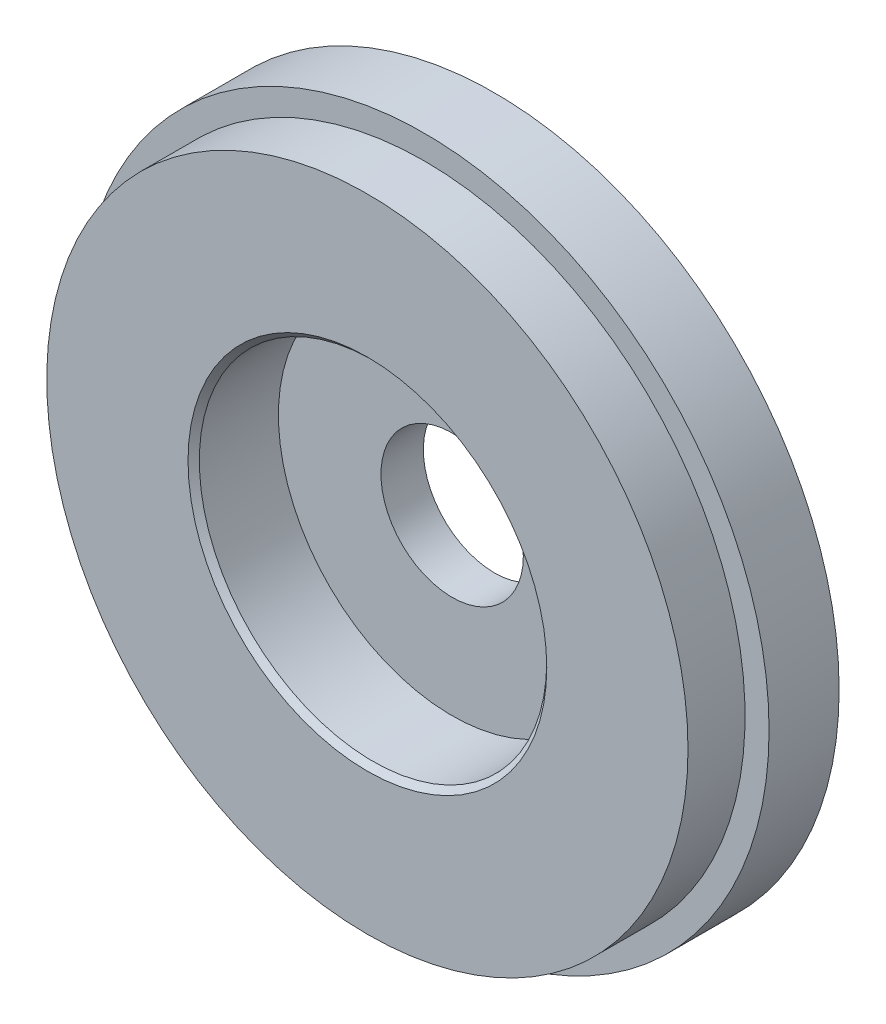
ISO-10303-21;
HEADER;
FILE_DESCRIPTION(('STEP AP214'),'2;1');
FILE_NAME('part.step','',(''),(''),'','','');
FILE_SCHEMA(('AUTOMOTIVE_DESIGN { 1 0 10303 214 1 1 1 1 }'));
ENDSEC;
DATA;
#1=APPLICATION_CONTEXT('core data for automotive mechanical design processes');
#2=APPLICATION_PROTOCOL_DEFINITION('international standard','automotive_design',2000,#1);
#3=PRODUCT_CONTEXT('',#1,'mechanical');
#4=PRODUCT('Part','Part','',(#3));
#5=PRODUCT_RELATED_PRODUCT_CATEGORY('part','',(#4));
#6=PRODUCT_DEFINITION_FORMATION('','',#4);
#7=PRODUCT_DEFINITION_CONTEXT('part definition',#1,'design');
#8=PRODUCT_DEFINITION('design','',#6,#7);
#9=PRODUCT_DEFINITION_SHAPE('','',#8);
#10=(LENGTH_UNIT() NAMED_UNIT(*) SI_UNIT(.MILLI.,.METRE.));
#11=(NAMED_UNIT(*) PLANE_ANGLE_UNIT() SI_UNIT($,.RADIAN.));
#12=(NAMED_UNIT(*) SI_UNIT($,.STERADIAN.) SOLID_ANGLE_UNIT());
#13=UNCERTAINTY_MEASURE_WITH_UNIT(LENGTH_MEASURE(1.E-05),#10,'distance_accuracy_value','');
#14=(GEOMETRIC_REPRESENTATION_CONTEXT(3) GLOBAL_UNCERTAINTY_ASSIGNED_CONTEXT((#13)) GLOBAL_UNIT_ASSIGNED_CONTEXT((#10,
#11,#12)) REPRESENTATION_CONTEXT('',''));
#15=CARTESIAN_POINT('',(0.,0.,0.));
#16=DIRECTION('',(0.,0.,1.));
#17=DIRECTION('',(1.,0.,0.));
#18=AXIS2_PLACEMENT_3D('',#15,#16,#17);
#19=CARTESIAN_POINT('',(-22.8039864852608,9.35030714292408,4.98));
#20=DIRECTION('',(0.,0.,-1.));
#21=DIRECTION('',(-1.,0.,0.));
#22=AXIS2_PLACEMENT_3D('',#19,#20,#21);
#23=CYLINDRICAL_SURFACE('',#22,12.2);
#24=CARTESIAN_POINT('',(-22.8039864852608,9.35030714292408,4.98));
#25=DIRECTION('',(0.,0.,1.));
#26=DIRECTION('',(0.,-1.,0.));
#27=AXIS2_PLACEMENT_3D('',#24,#25,#26);
#28=CIRCLE('',#27,12.2);
#29=CARTESIAN_POINT('',(-35.0039864852608,9.35030714292408,4.98));
#30=VERTEX_POINT('',#29);
#31=EDGE_CURVE('E51',#30,#30,#28,.T.);
#32=CARTESIAN_POINT('',(-22.8039864852608,9.35030714292408,2.5));
#33=DIRECTION('',(0.,0.,1.));
#34=DIRECTION('',(0.,-1.,0.));
#35=AXIS2_PLACEMENT_3D('',#32,#33,#34);
#36=CIRCLE('',#35,12.2);
#37=CARTESIAN_POINT('',(-35.0039864852608,9.35030714292408,2.5));
#38=VERTEX_POINT('',#37);
#39=EDGE_CURVE('E54',#38,#38,#36,.T.);
#40=CARTESIAN_POINT('',(-35.0039864852608,9.35030714292408,4.98));
#41=CARTESIAN_POINT('',(-35.0039864852608,9.35030714292408,4.95416666666667));
#42=CARTESIAN_POINT('',(-35.0039864852608,9.35030714292408,4.92833333333333));
#43=CARTESIAN_POINT('',(-35.0039864852608,9.35030714292408,4.87666666666667));
#44=CARTESIAN_POINT('',(-35.0039864852608,9.35030714292408,4.85083333333333));
#45=CARTESIAN_POINT('',(-35.0039864852608,9.35030714292408,4.79916666666667));
#46=CARTESIAN_POINT('',(-35.0039864852608,9.35030714292408,4.77333333333334));
#47=CARTESIAN_POINT('',(-35.0039864852608,9.35030714292408,4.72166666666667));
#48=CARTESIAN_POINT('',(-35.0039864852608,9.35030714292408,4.69583333333333));
#49=CARTESIAN_POINT('',(-35.0039864852608,9.35030714292408,4.64416666666667));
#50=CARTESIAN_POINT('',(-35.0039864852608,9.35030714292408,4.61833333333333));
#51=CARTESIAN_POINT('',(-35.0039864852608,9.35030714292408,4.56666666666667));
#52=CARTESIAN_POINT('',(-35.0039864852608,9.35030714292408,4.54083333333334));
#53=CARTESIAN_POINT('',(-35.0039864852608,9.35030714292408,4.48916666666667));
#54=CARTESIAN_POINT('',(-35.0039864852608,9.35030714292408,4.46333333333333));
#55=CARTESIAN_POINT('',(-35.0039864852608,9.35030714292408,4.41166666666667));
#56=CARTESIAN_POINT('',(-35.0039864852608,9.35030714292408,4.38583333333333));
#57=CARTESIAN_POINT('',(-35.0039864852608,9.35030714292408,4.33416666666667));
#58=CARTESIAN_POINT('',(-35.0039864852608,9.35030714292408,4.30833333333334));
#59=CARTESIAN_POINT('',(-35.0039864852608,9.35030714292408,4.25666666666667));
#60=CARTESIAN_POINT('',(-35.0039864852608,9.35030714292408,4.23083333333333));
#61=CARTESIAN_POINT('',(-35.0039864852608,9.35030714292408,4.17916666666667));
#62=CARTESIAN_POINT('',(-35.0039864852608,9.35030714292408,4.15333333333333));
#63=CARTESIAN_POINT('',(-35.0039864852608,9.35030714292408,4.10166666666667));
#64=CARTESIAN_POINT('',(-35.0039864852608,9.35030714292408,4.07583333333333));
#65=CARTESIAN_POINT('',(-35.0039864852608,9.35030714292408,4.02416666666667));
#66=CARTESIAN_POINT('',(-35.0039864852608,9.35030714292408,3.99833333333333));
#67=CARTESIAN_POINT('',(-35.0039864852608,9.35030714292408,3.94666666666667));
#68=CARTESIAN_POINT('',(-35.0039864852608,9.35030714292408,3.92083333333333));
#69=CARTESIAN_POINT('',(-35.0039864852608,9.35030714292408,3.86916666666667));
#70=CARTESIAN_POINT('',(-35.0039864852608,9.35030714292408,3.84333333333334));
#71=CARTESIAN_POINT('',(-35.0039864852608,9.35030714292408,3.79166666666667));
#72=CARTESIAN_POINT('',(-35.0039864852608,9.35030714292408,3.76583333333333));
#73=CARTESIAN_POINT('',(-35.0039864852608,9.35030714292408,3.71416666666667));
#74=CARTESIAN_POINT('',(-35.0039864852608,9.35030714292408,3.68833333333333));
#75=CARTESIAN_POINT('',(-35.0039864852608,9.35030714292408,3.63666666666667));
#76=CARTESIAN_POINT('',(-35.0039864852608,9.35030714292408,3.61083333333333));
#77=CARTESIAN_POINT('',(-35.0039864852608,9.35030714292408,3.55916666666667));
#78=CARTESIAN_POINT('',(-35.0039864852608,9.35030714292408,3.53333333333333));
#79=CARTESIAN_POINT('',(-35.0039864852608,9.35030714292408,3.48166666666667));
#80=CARTESIAN_POINT('',(-35.0039864852608,9.35030714292408,3.45583333333333));
#81=CARTESIAN_POINT('',(-35.0039864852608,9.35030714292408,3.40416666666667));
#82=CARTESIAN_POINT('',(-35.0039864852608,9.35030714292408,3.37833333333333));
#83=CARTESIAN_POINT('',(-35.0039864852608,9.35030714292408,3.32666666666667));
#84=CARTESIAN_POINT('',(-35.0039864852608,9.35030714292408,3.30083333333334));
#85=CARTESIAN_POINT('',(-35.0039864852608,9.35030714292408,3.24916666666667));
#86=CARTESIAN_POINT('',(-35.0039864852608,9.35030714292408,3.22333333333333));
#87=CARTESIAN_POINT('',(-35.0039864852608,9.35030714292408,3.17166666666667));
#88=CARTESIAN_POINT('',(-35.0039864852608,9.35030714292408,3.14583333333333));
#89=CARTESIAN_POINT('',(-35.0039864852608,9.35030714292408,3.09416666666667));
#90=CARTESIAN_POINT('',(-35.0039864852608,9.35030714292408,3.06833333333333));
#91=CARTESIAN_POINT('',(-35.0039864852608,9.35030714292408,3.01666666666667));
#92=CARTESIAN_POINT('',(-35.0039864852608,9.35030714292408,2.99083333333334));
#93=CARTESIAN_POINT('',(-35.0039864852608,9.35030714292408,2.93916666666667));
#94=CARTESIAN_POINT('',(-35.0039864852608,9.35030714292408,2.91333333333333));
#95=CARTESIAN_POINT('',(-35.0039864852608,9.35030714292408,2.86166666666667));
#96=CARTESIAN_POINT('',(-35.0039864852608,9.35030714292408,2.83583333333333));
#97=CARTESIAN_POINT('',(-35.0039864852608,9.35030714292408,2.78416666666667));
#98=CARTESIAN_POINT('',(-35.0039864852608,9.35030714292408,2.75833333333333));
#99=CARTESIAN_POINT('',(-35.0039864852608,9.35030714292408,2.70666666666667));
#100=CARTESIAN_POINT('',(-35.0039864852608,9.35030714292408,2.68083333333333));
#101=CARTESIAN_POINT('',(-35.0039864852608,9.35030714292408,2.62916666666667));
#102=CARTESIAN_POINT('',(-35.0039864852608,9.35030714292408,2.60333333333333));
#103=CARTESIAN_POINT('',(-35.0039864852608,9.35030714292408,2.55166666666667));
#104=CARTESIAN_POINT('',(-35.0039864852608,9.35030714292408,2.52583333333333));
#105=CARTESIAN_POINT('',(-35.0039864852608,9.35030714292408,2.5));
#106=B_SPLINE_CURVE_WITH_KNOTS('',3,(#40,#41,#42,#43,#44,#45,#46,#47,#48,#49,#50,#51,#52,#53,
#54,#55,#56,#57,#58,#59,#60,#61,#62,#63,#64,#65,#66,#67,#68,#69,#70,#71,#72,#73,#74,#75,#76,#77,
#78,#79,#80,#81,#82,#83,#84,#85,#86,#87,#88,#89,#90,#91,#92,#93,#94,#95,#96,#97,#98,#99,#100,
#101,#102,#103,#104,#105),.UNSPECIFIED.,.F.,.F.,(4,2,2,2,2,2,2,2,2,2,2,2,2,2,2,2,2,2,2,2,2,2,2,
2,2,2,2,2,2,2,2,2,4),(0.,0.0775000000000003,0.155000000000001,0.2325,0.31,0.387500000000001,
0.465,0.5425,0.620000000000001,0.6975,0.775,0.852500000000001,0.93,1.0075,1.085,1.1625,1.24,
1.3175,1.395,1.4725,1.55,1.6275,1.705,1.7825,1.86,1.9375,2.015,2.0925,2.17,2.2475,2.325,2.4025,
2.48),.UNSPECIFIED.);
#107=EDGE_CURVE('BSEAM35',#30,#38,#106,.T.);
#108=ORIENTED_EDGE('',*,*,#31,.F.);
#109=ORIENTED_EDGE('',*,*,#39,.T.);
#110=ORIENTED_EDGE('',*,*,#107,.T.);
#111=ORIENTED_EDGE('',*,*,#107,.F.);
#112=EDGE_LOOP('',(#108,#110,#109,#111));
#113=FACE_BOUND('',#112,.T.);
#114=ADVANCED_FACE('F35',(#113),#23,.T.);
#115=CARTESIAN_POINT('',(-22.8039864852608,9.35030714292408,4.98));
#116=DIRECTION('',(0.,0.,1.));
#117=DIRECTION('',(0.,-1.,0.));
#118=AXIS2_PLACEMENT_3D('',#115,#116,#117);
#119=PLANE('',#118);
#120=CARTESIAN_POINT('',(-22.8039864852608,9.35030714292408,4.98));
#121=DIRECTION('',(0.,0.,1.));
#122=DIRECTION('',(0.,-1.,0.));
#123=AXIS2_PLACEMENT_3D('',#120,#121,#122);
#124=CIRCLE('',#123,11.35);
#125=CARTESIAN_POINT('',(-22.8039864852608,-1.99969285707591,4.98));
#126=VERTEX_POINT('',#125);
#127=EDGE_CURVE('E47',#126,#126,#124,.T.);
#128=ORIENTED_EDGE('',*,*,#127,.F.);
#129=EDGE_LOOP('',(#128));
#130=FACE_BOUND('',#129,.T.);
#131=ORIENTED_EDGE('',*,*,#31,.T.);
#132=EDGE_LOOP('',(#131));
#133=FACE_BOUND('',#132,.T.);
#134=ADVANCED_FACE('F92',(#130,#133),#119,.T.);
#135=CARTESIAN_POINT('',(-22.8039864852608,9.35030714292408,2.5));
#136=DIRECTION('',(0.,0.,1.));
#137=DIRECTION('',(0.,-1.,0.));
#138=AXIS2_PLACEMENT_3D('',#135,#136,#137);
#139=PLANE('',#138);
#140=CARTESIAN_POINT('',(-22.8039864852608,9.35030714292408,2.5));
#141=DIRECTION('',(0.,0.,1.));
#142=DIRECTION('',(0.,-1.,0.));
#143=AXIS2_PLACEMENT_3D('',#140,#141,#142);
#144=CIRCLE('',#143,2.52);
#145=CARTESIAN_POINT('',(-22.8039864852608,6.83030714292408,2.5));
#146=VERTEX_POINT('',#145);
#147=EDGE_CURVE('E65',#146,#146,#144,.F.);
#148=ORIENTED_EDGE('',*,*,#147,.F.);
#149=EDGE_LOOP('',(#148));
#150=FACE_BOUND('',#149,.T.);
#151=ORIENTED_EDGE('',*,*,#39,.F.);
#152=EDGE_LOOP('',(#151));
#153=FACE_BOUND('',#152,.T.);
#154=ADVANCED_FACE('F97',(#150,#153),#139,.F.);
#155=CARTESIAN_POINT('',(-22.8039864852608,9.35030714292408,39.1026478658693));
#156=DIRECTION('',(0.,0.,-1.));
#157=DIRECTION('',(-1.,0.,0.));
#158=AXIS2_PLACEMENT_3D('',#155,#156,#157);
#159=CYLINDRICAL_SURFACE('',#158,11.35);
#160=ORIENTED_EDGE('',*,*,#127,.T.);
#161=EDGE_LOOP('',(#160));
#162=FACE_BOUND('',#161,.T.);
#163=CARTESIAN_POINT('',(-22.8039864852608,9.35030714292408,7.));
#164=DIRECTION('',(0.,0.,1.));
#165=DIRECTION('',(1.,0.,0.));
#166=AXIS2_PLACEMENT_3D('',#163,#164,#165);
#167=CIRCLE('',#166,11.35);
#168=CARTESIAN_POINT('',(-11.4539864852608,9.35030714292408,7.));
#169=VERTEX_POINT('',#168);
#170=EDGE_CURVE('E57',#169,#169,#167,.T.);
#171=ORIENTED_EDGE('',*,*,#170,.F.);
#172=EDGE_LOOP('',(#171));
#173=FACE_BOUND('',#172,.T.);
#174=ADVANCED_FACE('F88',(#162,#173),#159,.T.);
#175=CARTESIAN_POINT('',(-22.8039864852608,9.35030714292408,7.));
#176=DIRECTION('',(0.,0.,1.));
#177=DIRECTION('',(1.,0.,0.));
#178=AXIS2_PLACEMENT_3D('',#175,#176,#177);
#179=PLANE('',#178);
#180=CARTESIAN_POINT('',(-22.8039864852608,9.35030714292408,7.));
#181=DIRECTION('',(0.,0.,1.));
#182=DIRECTION('',(1.,0.,0.));
#183=AXIS2_PLACEMENT_3D('',#180,#181,#182);
#184=CIRCLE('',#183,6.35);
#185=CARTESIAN_POINT('',(-16.4539864852608,9.35030714292408,7.));
#186=VERTEX_POINT('',#185);
#187=EDGE_CURVE('E10',#186,#186,#184,.F.);
#188=ORIENTED_EDGE('',*,*,#187,.T.);
#189=EDGE_LOOP('',(#188));
#190=FACE_BOUND('',#189,.T.);
#191=ORIENTED_EDGE('',*,*,#170,.T.);
#192=EDGE_LOOP('',(#191));
#193=FACE_BOUND('',#192,.T.);
#194=ADVANCED_FACE('F83',(#190,#193),#179,.T.);
#195=CARTESIAN_POINT('',(-22.8039864852608,9.35030714292408,4.));
#196=DIRECTION('',(0.,0.,1.));
#197=DIRECTION('',(1.,0.,0.));
#198=AXIS2_PLACEMENT_3D('',#195,#196,#197);
#199=CYLINDRICAL_SURFACE('',#198,6.15);
#200=CARTESIAN_POINT('',(-22.8039864852608,9.35030714292408,6.80000000000001));
#201=DIRECTION('',(0.,0.,1.));
#202=DIRECTION('',(1.,0.,0.));
#203=AXIS2_PLACEMENT_3D('',#200,#201,#202);
#204=CIRCLE('',#203,6.15);
#205=CARTESIAN_POINT('',(-16.6539864852608,9.35030714292408,6.80000000000001));
#206=VERTEX_POINT('',#205);
#207=EDGE_CURVE('E43',#206,#206,#204,.T.);
#208=ORIENTED_EDGE('',*,*,#207,.T.);
#209=EDGE_LOOP('',(#208));
#210=FACE_BOUND('',#209,.T.);
#211=CARTESIAN_POINT('',(-22.8039864852608,9.35030714292408,4.));
#212=DIRECTION('',(0.,0.,1.));
#213=DIRECTION('',(1.,0.,0.));
#214=AXIS2_PLACEMENT_3D('',#211,#212,#213);
#215=CIRCLE('',#214,6.15);
#216=CARTESIAN_POINT('',(-16.6539864852608,9.35030714292408,4.));
#217=VERTEX_POINT('',#216);
#218=EDGE_CURVE('E61',#217,#217,#215,.T.);
#219=ORIENTED_EDGE('',*,*,#218,.F.);
#220=EDGE_LOOP('',(#219));
#221=FACE_BOUND('',#220,.T.);
#222=ADVANCED_FACE('F78',(#210,#221),#199,.F.);
#223=CARTESIAN_POINT('',(-22.8039864852608,9.35030714292408,4.));
#224=DIRECTION('',(0.,0.,1.));
#225=DIRECTION('',(1.,0.,0.));
#226=AXIS2_PLACEMENT_3D('',#223,#224,#225);
#227=PLANE('',#226);
#228=CARTESIAN_POINT('',(-22.8039864852608,9.35030714292408,4.));
#229=DIRECTION('',(0.,0.,1.));
#230=DIRECTION('',(1.,0.,0.));
#231=AXIS2_PLACEMENT_3D('',#228,#229,#230);
#232=CIRCLE('',#231,2.52);
#233=CARTESIAN_POINT('',(-20.2839864852608,9.35030714292408,4.));
#234=VERTEX_POINT('',#233);
#235=EDGE_CURVE('E68',#234,#234,#232,.T.);
#236=ORIENTED_EDGE('',*,*,#235,.F.);
#237=EDGE_LOOP('',(#236));
#238=FACE_BOUND('',#237,.T.);
#239=ORIENTED_EDGE('',*,*,#218,.T.);
#240=EDGE_LOOP('',(#239));
#241=FACE_BOUND('',#240,.T.);
#242=ADVANCED_FACE('F75',(#238,#241),#227,.T.);
#243=CARTESIAN_POINT('',(-22.8039864852608,9.35030714292408,6.80000000000001));
#244=DIRECTION('',(0.,0.,1.));
#245=DIRECTION('',(1.,0.,0.));
#246=AXIS2_PLACEMENT_3D('',#243,#244,#245);
#247=CONICAL_SURFACE('',#246,6.15,0.785398163397455);
#248=ORIENTED_EDGE('',*,*,#187,.F.);
#249=EDGE_LOOP('',(#248));
#250=FACE_BOUND('',#249,.T.);
#251=ORIENTED_EDGE('',*,*,#207,.F.);
#252=EDGE_LOOP('',(#251));
#253=FACE_BOUND('',#252,.T.);
#254=ADVANCED_FACE('F38',(#250,#253),#247,.F.);
#255=CARTESIAN_POINT('',(-22.8039864852608,9.35030714292408,2.499));
#256=DIRECTION('',(0.,0.,1.));
#257=DIRECTION('',(1.,0.,0.));
#258=AXIS2_PLACEMENT_3D('',#255,#256,#257);
#259=CYLINDRICAL_SURFACE('',#258,2.52);
#260=ORIENTED_EDGE('',*,*,#235,.T.);
#261=EDGE_LOOP('',(#260));
#262=FACE_BOUND('',#261,.T.);
#263=ORIENTED_EDGE('',*,*,#147,.T.);
#264=EDGE_LOOP('',(#263));
#265=FACE_BOUND('',#264,.T.);
#266=ADVANCED_FACE('F72',(#262,#265),#259,.F.);
#267=CLOSED_SHELL('',(#114,#134,#154,#174,#194,#222,#242,#254,#266));
#268=MANIFOLD_SOLID_BREP('B2',#267);
#269=ADVANCED_BREP_SHAPE_REPRESENTATION('',(#18,#268),#14);
#270=SHAPE_DEFINITION_REPRESENTATION(#9,#269);
ENDSEC;
END-ISO-10303-21;
